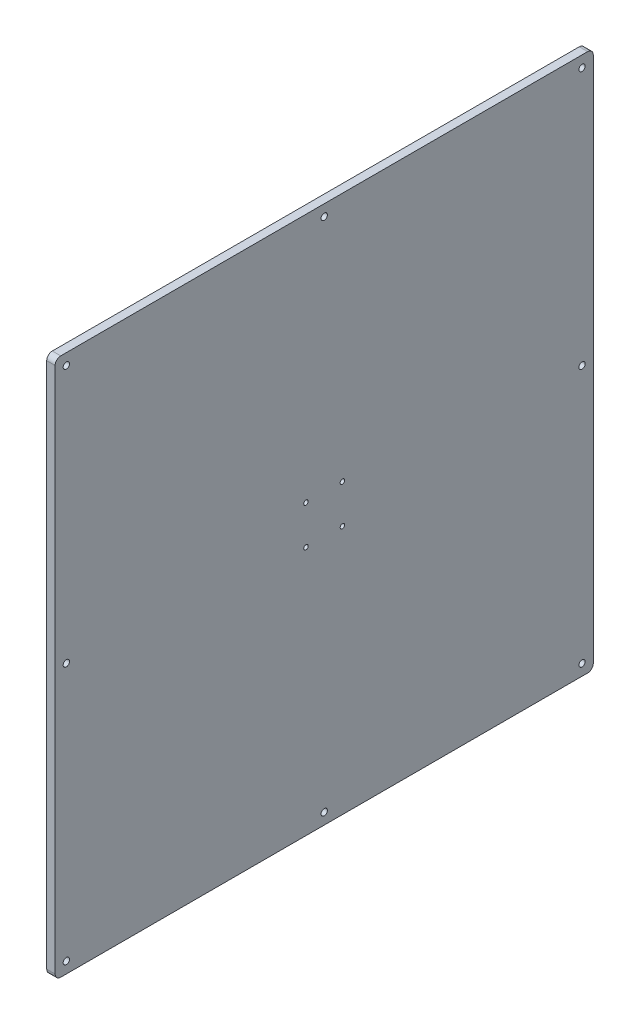
ISO-10303-21;
HEADER;
FILE_DESCRIPTION(('STEP AP214'),'2;1');
FILE_NAME('part.step','',(''),(''),'','','');
FILE_SCHEMA(('AUTOMOTIVE_DESIGN { 1 0 10303 214 1 1 1 1 }'));
ENDSEC;
DATA;
#1=APPLICATION_CONTEXT('core data for automotive mechanical design processes');
#2=APPLICATION_PROTOCOL_DEFINITION('international standard','automotive_design',2000,#1);
#3=PRODUCT_CONTEXT('',#1,'mechanical');
#4=PRODUCT('Part','Part','',(#3));
#5=PRODUCT_RELATED_PRODUCT_CATEGORY('part','',(#4));
#6=PRODUCT_DEFINITION_FORMATION('','',#4);
#7=PRODUCT_DEFINITION_CONTEXT('part definition',#1,'design');
#8=PRODUCT_DEFINITION('design','',#6,#7);
#9=PRODUCT_DEFINITION_SHAPE('','',#8);
#10=(LENGTH_UNIT() NAMED_UNIT(*) SI_UNIT(.MILLI.,.METRE.));
#11=(NAMED_UNIT(*) PLANE_ANGLE_UNIT() SI_UNIT($,.RADIAN.));
#12=(NAMED_UNIT(*) SI_UNIT($,.STERADIAN.) SOLID_ANGLE_UNIT());
#13=UNCERTAINTY_MEASURE_WITH_UNIT(LENGTH_MEASURE(1.E-05),#10,'distance_accuracy_value','');
#14=(GEOMETRIC_REPRESENTATION_CONTEXT(3) GLOBAL_UNCERTAINTY_ASSIGNED_CONTEXT((#13)) GLOBAL_UNIT_ASSIGNED_CONTEXT((#10,
#11,#12)) REPRESENTATION_CONTEXT('',''));
#15=CARTESIAN_POINT('',(0.,0.,0.));
#16=DIRECTION('',(0.,0.,1.));
#17=DIRECTION('',(1.,0.,0.));
#18=AXIS2_PLACEMENT_3D('',#15,#16,#17);
#19=CARTESIAN_POINT('',(9.525,-304.8,-304.8));
#20=DIRECTION('',(0.,0.,1.));
#21=DIRECTION('',(1.,0.,0.));
#22=AXIS2_PLACEMENT_3D('',#19,#20,#21);
#23=PLANE('',#22);
#24=DIRECTION('',(0.,1.,0.));
#25=VECTOR('',#24,1.);
#26=CARTESIAN_POINT('',(9.525,-304.8,-304.8));
#27=LINE('',#26,#25);
#28=CARTESIAN_POINT('',(9.525,-298.45,-304.8));
#29=VERTEX_POINT('',#28);
#30=CARTESIAN_POINT('',(9.525,298.45,-304.8));
#31=VERTEX_POINT('',#30);
#32=EDGE_CURVE('E149',#29,#31,#27,.T.);
#33=ORIENTED_EDGE('',*,*,#32,.F.);
#34=DIRECTION('',(-1.,0.,0.));
#35=VECTOR('',#34,1.);
#36=CARTESIAN_POINT('',(9.525,-298.45,-304.8));
#37=LINE('',#36,#35);
#38=CARTESIAN_POINT('',(0.,-298.45,-304.8));
#39=VERTEX_POINT('',#38);
#40=EDGE_CURVE('E188',#29,#39,#37,.T.);
#41=ORIENTED_EDGE('',*,*,#40,.T.);
#42=DIRECTION('',(0.,1.,0.));
#43=VECTOR('',#42,1.);
#44=CARTESIAN_POINT('',(0.,-304.8,-304.8));
#45=LINE('',#44,#43);
#46=CARTESIAN_POINT('',(0.,298.45,-304.8));
#47=VERTEX_POINT('',#46);
#48=EDGE_CURVE('E203',#39,#47,#45,.T.);
#49=ORIENTED_EDGE('',*,*,#48,.T.);
#50=DIRECTION('',(-1.,0.,0.));
#51=VECTOR('',#50,1.);
#52=CARTESIAN_POINT('',(9.525,298.45,-304.8));
#53=LINE('',#52,#51);
#54=EDGE_CURVE('E185',#47,#31,#53,.F.);
#55=ORIENTED_EDGE('',*,*,#54,.T.);
#56=EDGE_LOOP('',(#33,#41,#49,#55));
#57=FACE_BOUND('',#56,.T.);
#58=ADVANCED_FACE('F53',(#57),#23,.F.);
#59=CARTESIAN_POINT('',(9.525,304.8,304.8));
#60=DIRECTION('',(0.,-1.,0.));
#61=DIRECTION('',(0.,0.,-1.));
#62=AXIS2_PLACEMENT_3D('',#59,#60,#61);
#63=PLANE('',#62);
#64=DIRECTION('',(0.,0.,1.));
#65=VECTOR('',#64,1.);
#66=CARTESIAN_POINT('',(9.525,304.8,304.8));
#67=LINE('',#66,#65);
#68=CARTESIAN_POINT('',(9.525,304.8,-298.45));
#69=VERTEX_POINT('',#68);
#70=CARTESIAN_POINT('',(9.525,304.8,298.45));
#71=VERTEX_POINT('',#70);
#72=EDGE_CURVE('E154',#69,#71,#67,.T.);
#73=ORIENTED_EDGE('',*,*,#72,.F.);
#74=DIRECTION('',(-1.,0.,0.));
#75=VECTOR('',#74,1.);
#76=CARTESIAN_POINT('',(9.525,304.8,-298.45));
#77=LINE('',#76,#75);
#78=CARTESIAN_POINT('',(0.,304.8,-298.45));
#79=VERTEX_POINT('',#78);
#80=EDGE_CURVE('E11',#69,#79,#77,.T.);
#81=ORIENTED_EDGE('',*,*,#80,.T.);
#82=DIRECTION('',(0.,0.,1.));
#83=VECTOR('',#82,1.);
#84=CARTESIAN_POINT('',(0.,304.8,304.8));
#85=LINE('',#84,#83);
#86=CARTESIAN_POINT('',(0.,304.8,298.45));
#87=VERTEX_POINT('',#86);
#88=EDGE_CURVE('E156',#79,#87,#85,.T.);
#89=ORIENTED_EDGE('',*,*,#88,.T.);
#90=DIRECTION('',(-1.,0.,0.));
#91=VECTOR('',#90,1.);
#92=CARTESIAN_POINT('',(9.525,304.8,298.45));
#93=LINE('',#92,#91);
#94=EDGE_CURVE('E62',#87,#71,#93,.F.);
#95=ORIENTED_EDGE('',*,*,#94,.T.);
#96=EDGE_LOOP('',(#73,#81,#89,#95));
#97=FACE_BOUND('',#96,.T.);
#98=ADVANCED_FACE('F209',(#97),#63,.F.);
#99=CARTESIAN_POINT('',(9.525,-304.8,304.8));
#100=DIRECTION('',(0.,0.,-1.));
#101=DIRECTION('',(-1.,0.,0.));
#102=AXIS2_PLACEMENT_3D('',#99,#100,#101);
#103=PLANE('',#102);
#104=DIRECTION('',(0.,-1.,0.));
#105=VECTOR('',#104,1.);
#106=CARTESIAN_POINT('',(0.,-304.8,304.8));
#107=LINE('',#106,#105);
#108=CARTESIAN_POINT('',(0.,298.45,304.8));
#109=VERTEX_POINT('',#108);
#110=CARTESIAN_POINT('',(0.,-298.45,304.8));
#111=VERTEX_POINT('',#110);
#112=EDGE_CURVE('E150',#109,#111,#107,.T.);
#113=ORIENTED_EDGE('',*,*,#112,.T.);
#114=DIRECTION('',(-1.,0.,0.));
#115=VECTOR('',#114,1.);
#116=CARTESIAN_POINT('',(9.525,-298.45,304.8));
#117=LINE('',#116,#115);
#118=CARTESIAN_POINT('',(9.525,-298.45,304.8));
#119=VERTEX_POINT('',#118);
#120=EDGE_CURVE('E125',#111,#119,#117,.F.);
#121=ORIENTED_EDGE('',*,*,#120,.T.);
#122=DIRECTION('',(0.,-1.,0.));
#123=VECTOR('',#122,1.);
#124=CARTESIAN_POINT('',(9.525,-304.8,304.8));
#125=LINE('',#124,#123);
#126=CARTESIAN_POINT('',(9.525,298.45,304.8));
#127=VERTEX_POINT('',#126);
#128=EDGE_CURVE('E194',#127,#119,#125,.T.);
#129=ORIENTED_EDGE('',*,*,#128,.F.);
#130=DIRECTION('',(-1.,0.,0.));
#131=VECTOR('',#130,1.);
#132=CARTESIAN_POINT('',(9.525,298.45,304.8));
#133=LINE('',#132,#131);
#134=EDGE_CURVE('E131',#127,#109,#133,.T.);
#135=ORIENTED_EDGE('',*,*,#134,.T.);
#136=EDGE_LOOP('',(#113,#121,#129,#135));
#137=FACE_BOUND('',#136,.T.);
#138=ADVANCED_FACE('F216',(#137),#103,.F.);
#139=CARTESIAN_POINT('',(9.525,-304.8,304.8));
#140=DIRECTION('',(0.,1.,0.));
#141=DIRECTION('',(0.,0.,1.));
#142=AXIS2_PLACEMENT_3D('',#139,#140,#141);
#143=PLANE('',#142);
#144=DIRECTION('',(0.,0.,-1.));
#145=VECTOR('',#144,1.);
#146=CARTESIAN_POINT('',(9.525,-304.8,304.8));
#147=LINE('',#146,#145);
#148=CARTESIAN_POINT('',(9.525,-304.8,298.45));
#149=VERTEX_POINT('',#148);
#150=CARTESIAN_POINT('',(9.525,-304.8,-298.45));
#151=VERTEX_POINT('',#150);
#152=EDGE_CURVE('E141',#149,#151,#147,.T.);
#153=ORIENTED_EDGE('',*,*,#152,.F.);
#154=DIRECTION('',(-1.,0.,0.));
#155=VECTOR('',#154,1.);
#156=CARTESIAN_POINT('',(9.525,-304.8,298.45));
#157=LINE('',#156,#155);
#158=CARTESIAN_POINT('',(0.,-304.8,298.45));
#159=VERTEX_POINT('',#158);
#160=EDGE_CURVE('E124',#149,#159,#157,.T.);
#161=ORIENTED_EDGE('',*,*,#160,.T.);
#162=DIRECTION('',(0.,0.,-1.));
#163=VECTOR('',#162,1.);
#164=CARTESIAN_POINT('',(0.,-304.8,304.8));
#165=LINE('',#164,#163);
#166=CARTESIAN_POINT('',(0.,-304.8,-298.45));
#167=VERTEX_POINT('',#166);
#168=EDGE_CURVE('E138',#159,#167,#165,.T.);
#169=ORIENTED_EDGE('',*,*,#168,.T.);
#170=DIRECTION('',(-1.,0.,0.));
#171=VECTOR('',#170,1.);
#172=CARTESIAN_POINT('',(9.525,-304.8,-298.45));
#173=LINE('',#172,#171);
#174=EDGE_CURVE('E144',#167,#151,#173,.F.);
#175=ORIENTED_EDGE('',*,*,#174,.T.);
#176=EDGE_LOOP('',(#153,#161,#169,#175));
#177=FACE_BOUND('',#176,.T.);
#178=ADVANCED_FACE('F137',(#177),#143,.F.);
#179=CARTESIAN_POINT('',(9.525,0.,0.));
#180=DIRECTION('',(-1.,0.,0.));
#181=DIRECTION('',(0.,0.,1.));
#182=AXIS2_PLACEMENT_3D('',#179,#180,#181);
#183=PLANE('',#182);
#184=CARTESIAN_POINT('',(9.525,292.1,292.1));
#185=DIRECTION('',(1.,0.,0.));
#186=DIRECTION('',(0.,0.,-1.));
#187=AXIS2_PLACEMENT_3D('',#184,#185,#186);
#188=CIRCLE('',#187,3.57123999999998);
#189=CARTESIAN_POINT('',(9.525,292.1,288.52876));
#190=VERTEX_POINT('',#189);
#191=EDGE_CURVE('E400',#190,#190,#188,.T.);
#192=ORIENTED_EDGE('',*,*,#191,.F.);
#193=EDGE_LOOP('',(#192));
#194=FACE_BOUND('',#193,.T.);
#195=CARTESIAN_POINT('',(9.525,292.1,-292.1));
#196=DIRECTION('',(1.,0.,0.));
#197=DIRECTION('',(0.,0.,-1.));
#198=AXIS2_PLACEMENT_3D('',#195,#196,#197);
#199=CIRCLE('',#198,3.57123999999998);
#200=CARTESIAN_POINT('',(9.525,292.1,-295.67124));
#201=VERTEX_POINT('',#200);
#202=EDGE_CURVE('E394',#201,#201,#199,.T.);
#203=ORIENTED_EDGE('',*,*,#202,.F.);
#204=EDGE_LOOP('',(#203));
#205=FACE_BOUND('',#204,.T.);
#206=CARTESIAN_POINT('',(9.525,-292.1,-292.1));
#207=DIRECTION('',(1.,0.,0.));
#208=DIRECTION('',(0.,0.,-1.));
#209=AXIS2_PLACEMENT_3D('',#206,#207,#208);
#210=CIRCLE('',#209,3.57123999999998);
#211=CARTESIAN_POINT('',(9.525,-292.1,-295.67124));
#212=VERTEX_POINT('',#211);
#213=EDGE_CURVE('E388',#212,#212,#210,.T.);
#214=ORIENTED_EDGE('',*,*,#213,.F.);
#215=EDGE_LOOP('',(#214));
#216=FACE_BOUND('',#215,.T.);
#217=CARTESIAN_POINT('',(9.525,-292.1,292.1));
#218=DIRECTION('',(1.,0.,0.));
#219=DIRECTION('',(0.,0.,-1.));
#220=AXIS2_PLACEMENT_3D('',#217,#218,#219);
#221=CIRCLE('',#220,3.57123999999998);
#222=CARTESIAN_POINT('',(9.525,-292.1,288.52876));
#223=VERTEX_POINT('',#222);
#224=EDGE_CURVE('E382',#223,#223,#221,.T.);
#225=ORIENTED_EDGE('',*,*,#224,.F.);
#226=EDGE_LOOP('',(#225));
#227=FACE_BOUND('',#226,.T.);
#228=CARTESIAN_POINT('',(9.525,292.1,0.));
#229=DIRECTION('',(1.,0.,0.));
#230=DIRECTION('',(0.,0.,-1.));
#231=AXIS2_PLACEMENT_3D('',#228,#229,#230);
#232=CIRCLE('',#231,3.57123999999998);
#233=CARTESIAN_POINT('',(9.525,292.1,-3.57123999999998));
#234=VERTEX_POINT('',#233);
#235=EDGE_CURVE('E376',#234,#234,#232,.T.);
#236=ORIENTED_EDGE('',*,*,#235,.F.);
#237=EDGE_LOOP('',(#236));
#238=FACE_BOUND('',#237,.T.);
#239=CARTESIAN_POINT('',(9.525,1.11022302462516E-13,292.1));
#240=DIRECTION('',(1.,0.,0.));
#241=DIRECTION('',(0.,0.,-1.));
#242=AXIS2_PLACEMENT_3D('',#239,#240,#241);
#243=CIRCLE('',#242,3.57124);
#244=CARTESIAN_POINT('',(9.525,1.11022302462516E-13,288.52876));
#245=VERTEX_POINT('',#244);
#246=EDGE_CURVE('E370',#245,#245,#243,.T.);
#247=ORIENTED_EDGE('',*,*,#246,.F.);
#248=EDGE_LOOP('',(#247));
#249=FACE_BOUND('',#248,.T.);
#250=CARTESIAN_POINT('',(9.525,-292.1,0.));
#251=DIRECTION('',(1.,0.,0.));
#252=DIRECTION('',(0.,0.,-1.));
#253=AXIS2_PLACEMENT_3D('',#250,#251,#252);
#254=CIRCLE('',#253,3.57123999999998);
#255=CARTESIAN_POINT('',(9.525,-292.1,-3.57123999999998));
#256=VERTEX_POINT('',#255);
#257=EDGE_CURVE('E364',#256,#256,#254,.T.);
#258=ORIENTED_EDGE('',*,*,#257,.F.);
#259=EDGE_LOOP('',(#258));
#260=FACE_BOUND('',#259,.T.);
#261=CARTESIAN_POINT('',(9.525,1.11022302462516E-13,-292.1));
#262=DIRECTION('',(1.,0.,0.));
#263=DIRECTION('',(0.,0.,-1.));
#264=AXIS2_PLACEMENT_3D('',#261,#262,#263);
#265=CIRCLE('',#264,3.57124);
#266=CARTESIAN_POINT('',(9.525,1.11022302462516E-13,-295.67124));
#267=VERTEX_POINT('',#266);
#268=EDGE_CURVE('E358',#267,#267,#265,.T.);
#269=ORIENTED_EDGE('',*,*,#268,.F.);
#270=EDGE_LOOP('',(#269));
#271=FACE_BOUND('',#270,.T.);
#272=CARTESIAN_POINT('',(9.525,21.9075,20.6375));
#273=DIRECTION('',(1.,0.,0.));
#274=DIRECTION('',(0.,0.,-1.));
#275=AXIS2_PLACEMENT_3D('',#272,#273,#274);
#276=CIRCLE('',#275,2.55269999999999);
#277=CARTESIAN_POINT('',(9.525,21.9075,18.0848));
#278=VERTEX_POINT('',#277);
#279=EDGE_CURVE('E352',#278,#278,#276,.T.);
#280=ORIENTED_EDGE('',*,*,#279,.F.);
#281=EDGE_LOOP('',(#280));
#282=FACE_BOUND('',#281,.T.);
#283=CARTESIAN_POINT('',(9.525,21.9075,-20.6375));
#284=DIRECTION('',(1.,0.,0.));
#285=DIRECTION('',(0.,0.,-1.));
#286=AXIS2_PLACEMENT_3D('',#283,#284,#285);
#287=CIRCLE('',#286,2.55269999999999);
#288=CARTESIAN_POINT('',(9.525,21.9075,-23.1902));
#289=VERTEX_POINT('',#288);
#290=EDGE_CURVE('E346',#289,#289,#287,.T.);
#291=ORIENTED_EDGE('',*,*,#290,.F.);
#292=EDGE_LOOP('',(#291));
#293=FACE_BOUND('',#292,.T.);
#294=CARTESIAN_POINT('',(9.525,-21.9075,-20.6375));
#295=DIRECTION('',(1.,0.,0.));
#296=DIRECTION('',(0.,0.,-1.));
#297=AXIS2_PLACEMENT_3D('',#294,#295,#296);
#298=CIRCLE('',#297,2.55269999999999);
#299=CARTESIAN_POINT('',(9.525,-21.9075,-23.1902));
#300=VERTEX_POINT('',#299);
#301=EDGE_CURVE('E340',#300,#300,#298,.T.);
#302=ORIENTED_EDGE('',*,*,#301,.F.);
#303=EDGE_LOOP('',(#302));
#304=FACE_BOUND('',#303,.T.);
#305=CARTESIAN_POINT('',(9.525,-21.9075,20.6375));
#306=DIRECTION('',(1.,0.,0.));
#307=DIRECTION('',(0.,0.,-1.));
#308=AXIS2_PLACEMENT_3D('',#305,#306,#307);
#309=CIRCLE('',#308,2.55269999999999);
#310=CARTESIAN_POINT('',(9.525,-21.9075,18.0848));
#311=VERTEX_POINT('',#310);
#312=EDGE_CURVE('E333',#311,#311,#309,.T.);
#313=ORIENTED_EDGE('',*,*,#312,.F.);
#314=EDGE_LOOP('',(#313));
#315=FACE_BOUND('',#314,.T.);
#316=ORIENTED_EDGE('',*,*,#128,.T.);
#317=CARTESIAN_POINT('',(9.525,-298.45,298.45));
#318=DIRECTION('',(-1.,0.,0.));
#319=DIRECTION('',(0.,0.,1.));
#320=AXIS2_PLACEMENT_3D('',#317,#318,#319);
#321=CIRCLE('',#320,6.35);
#322=EDGE_CURVE('E182',#119,#149,#321,.F.);
#323=ORIENTED_EDGE('',*,*,#322,.T.);
#324=ORIENTED_EDGE('',*,*,#152,.T.);
#325=CARTESIAN_POINT('',(9.525,-298.45,-298.45));
#326=DIRECTION('',(-1.,0.,0.));
#327=DIRECTION('',(0.,0.,1.));
#328=AXIS2_PLACEMENT_3D('',#325,#326,#327);
#329=CIRCLE('',#328,6.35);
#330=EDGE_CURVE('E179',#151,#29,#329,.F.);
#331=ORIENTED_EDGE('',*,*,#330,.T.);
#332=ORIENTED_EDGE('',*,*,#32,.T.);
#333=CARTESIAN_POINT('',(9.525,298.45,-298.45));
#334=DIRECTION('',(-1.,0.,0.));
#335=DIRECTION('',(0.,0.,1.));
#336=AXIS2_PLACEMENT_3D('',#333,#334,#335);
#337=CIRCLE('',#336,6.35);
#338=EDGE_CURVE('E75',#31,#69,#337,.F.);
#339=ORIENTED_EDGE('',*,*,#338,.T.);
#340=ORIENTED_EDGE('',*,*,#72,.T.);
#341=CARTESIAN_POINT('',(9.525,298.45,298.45));
#342=DIRECTION('',(-1.,0.,0.));
#343=DIRECTION('',(0.,0.,1.));
#344=AXIS2_PLACEMENT_3D('',#341,#342,#343);
#345=CIRCLE('',#344,6.35);
#346=EDGE_CURVE('E174',#71,#127,#345,.F.);
#347=ORIENTED_EDGE('',*,*,#346,.T.);
#348=EDGE_LOOP('',(#316,#323,#324,#331,#332,#339,#340,#347));
#349=FACE_BOUND('',#348,.T.);
#350=ADVANCED_FACE('F214',(#194,#205,#216,#227,#238,#249,#260,#271,#282,#293,#304,#315,#349),
#183,.F.);
#351=CARTESIAN_POINT('',(0.,0.,0.));
#352=DIRECTION('',(-1.,0.,0.));
#353=DIRECTION('',(0.,0.,1.));
#354=AXIS2_PLACEMENT_3D('',#351,#352,#353);
#355=PLANE('',#354);
#356=CARTESIAN_POINT('',(0.,292.1,292.1));
#357=DIRECTION('',(1.,0.,0.));
#358=DIRECTION('',(0.,0.,-1.));
#359=AXIS2_PLACEMENT_3D('',#356,#357,#358);
#360=CIRCLE('',#359,3.57123999999998);
#361=CARTESIAN_POINT('',(0.,292.1,288.52876));
#362=VERTEX_POINT('',#361);
#363=EDGE_CURVE('E290',#362,#362,#360,.T.);
#364=ORIENTED_EDGE('',*,*,#363,.T.);
#365=EDGE_LOOP('',(#364));
#366=FACE_BOUND('',#365,.T.);
#367=CARTESIAN_POINT('',(0.,292.1,-292.1));
#368=DIRECTION('',(1.,0.,0.));
#369=DIRECTION('',(0.,0.,-1.));
#370=AXIS2_PLACEMENT_3D('',#367,#368,#369);
#371=CIRCLE('',#370,3.57123999999998);
#372=CARTESIAN_POINT('',(0.,292.1,-295.67124));
#373=VERTEX_POINT('',#372);
#374=EDGE_CURVE('E294',#373,#373,#371,.T.);
#375=ORIENTED_EDGE('',*,*,#374,.T.);
#376=EDGE_LOOP('',(#375));
#377=FACE_BOUND('',#376,.T.);
#378=CARTESIAN_POINT('',(0.,-292.1,-292.1));
#379=DIRECTION('',(1.,0.,0.));
#380=DIRECTION('',(0.,0.,-1.));
#381=AXIS2_PLACEMENT_3D('',#378,#379,#380);
#382=CIRCLE('',#381,3.57123999999998);
#383=CARTESIAN_POINT('',(0.,-292.1,-295.67124));
#384=VERTEX_POINT('',#383);
#385=EDGE_CURVE('E298',#384,#384,#382,.T.);
#386=ORIENTED_EDGE('',*,*,#385,.T.);
#387=EDGE_LOOP('',(#386));
#388=FACE_BOUND('',#387,.T.);
#389=CARTESIAN_POINT('',(0.,-292.1,292.1));
#390=DIRECTION('',(1.,0.,0.));
#391=DIRECTION('',(0.,0.,-1.));
#392=AXIS2_PLACEMENT_3D('',#389,#390,#391);
#393=CIRCLE('',#392,3.57123999999998);
#394=CARTESIAN_POINT('',(0.,-292.1,288.52876));
#395=VERTEX_POINT('',#394);
#396=EDGE_CURVE('E302',#395,#395,#393,.T.);
#397=ORIENTED_EDGE('',*,*,#396,.T.);
#398=EDGE_LOOP('',(#397));
#399=FACE_BOUND('',#398,.T.);
#400=CARTESIAN_POINT('',(0.,292.1,0.));
#401=DIRECTION('',(1.,0.,0.));
#402=DIRECTION('',(0.,0.,-1.));
#403=AXIS2_PLACEMENT_3D('',#400,#401,#402);
#404=CIRCLE('',#403,3.57123999999998);
#405=CARTESIAN_POINT('',(0.,292.1,-3.57123999999998));
#406=VERTEX_POINT('',#405);
#407=EDGE_CURVE('E306',#406,#406,#404,.T.);
#408=ORIENTED_EDGE('',*,*,#407,.T.);
#409=EDGE_LOOP('',(#408));
#410=FACE_BOUND('',#409,.T.);
#411=CARTESIAN_POINT('',(0.,1.11022302462516E-13,292.1));
#412=DIRECTION('',(1.,0.,0.));
#413=DIRECTION('',(0.,0.,-1.));
#414=AXIS2_PLACEMENT_3D('',#411,#412,#413);
#415=CIRCLE('',#414,3.57124);
#416=CARTESIAN_POINT('',(0.,1.11022302462516E-13,288.52876));
#417=VERTEX_POINT('',#416);
#418=EDGE_CURVE('E310',#417,#417,#415,.T.);
#419=ORIENTED_EDGE('',*,*,#418,.T.);
#420=EDGE_LOOP('',(#419));
#421=FACE_BOUND('',#420,.T.);
#422=CARTESIAN_POINT('',(0.,-292.1,0.));
#423=DIRECTION('',(1.,0.,0.));
#424=DIRECTION('',(0.,0.,-1.));
#425=AXIS2_PLACEMENT_3D('',#422,#423,#424);
#426=CIRCLE('',#425,3.57123999999998);
#427=CARTESIAN_POINT('',(0.,-292.1,-3.57123999999998));
#428=VERTEX_POINT('',#427);
#429=EDGE_CURVE('E314',#428,#428,#426,.T.);
#430=ORIENTED_EDGE('',*,*,#429,.T.);
#431=EDGE_LOOP('',(#430));
#432=FACE_BOUND('',#431,.T.);
#433=CARTESIAN_POINT('',(0.,1.11022302462516E-13,-292.1));
#434=DIRECTION('',(1.,0.,0.));
#435=DIRECTION('',(0.,0.,-1.));
#436=AXIS2_PLACEMENT_3D('',#433,#434,#435);
#437=CIRCLE('',#436,3.57124);
#438=CARTESIAN_POINT('',(0.,1.11022302462516E-13,-295.67124));
#439=VERTEX_POINT('',#438);
#440=EDGE_CURVE('E317',#439,#439,#437,.T.);
#441=ORIENTED_EDGE('',*,*,#440,.T.);
#442=EDGE_LOOP('',(#441));
#443=FACE_BOUND('',#442,.T.);
#444=CARTESIAN_POINT('',(0.,21.9075,20.6375));
#445=DIRECTION('',(1.,0.,0.));
#446=DIRECTION('',(0.,0.,-1.));
#447=AXIS2_PLACEMENT_3D('',#444,#445,#446);
#448=CIRCLE('',#447,2.55269999999999);
#449=CARTESIAN_POINT('',(0.,21.9075,18.0848));
#450=VERTEX_POINT('',#449);
#451=EDGE_CURVE('E321',#450,#450,#448,.T.);
#452=ORIENTED_EDGE('',*,*,#451,.T.);
#453=EDGE_LOOP('',(#452));
#454=FACE_BOUND('',#453,.T.);
#455=CARTESIAN_POINT('',(0.,21.9075,-20.6375));
#456=DIRECTION('',(1.,0.,0.));
#457=DIRECTION('',(0.,0.,-1.));
#458=AXIS2_PLACEMENT_3D('',#455,#456,#457);
#459=CIRCLE('',#458,2.55269999999999);
#460=CARTESIAN_POINT('',(0.,21.9075,-23.1902));
#461=VERTEX_POINT('',#460);
#462=EDGE_CURVE('E325',#461,#461,#459,.T.);
#463=ORIENTED_EDGE('',*,*,#462,.T.);
#464=EDGE_LOOP('',(#463));
#465=FACE_BOUND('',#464,.T.);
#466=CARTESIAN_POINT('',(0.,-21.9075,-20.6375));
#467=DIRECTION('',(1.,0.,0.));
#468=DIRECTION('',(0.,0.,-1.));
#469=AXIS2_PLACEMENT_3D('',#466,#467,#468);
#470=CIRCLE('',#469,2.55269999999999);
#471=CARTESIAN_POINT('',(0.,-21.9075,-23.1902));
#472=VERTEX_POINT('',#471);
#473=EDGE_CURVE('E329',#472,#472,#470,.T.);
#474=ORIENTED_EDGE('',*,*,#473,.T.);
#475=EDGE_LOOP('',(#474));
#476=FACE_BOUND('',#475,.T.);
#477=CARTESIAN_POINT('',(0.,-21.9075,20.6375));
#478=DIRECTION('',(1.,0.,0.));
#479=DIRECTION('',(0.,0.,-1.));
#480=AXIS2_PLACEMENT_3D('',#477,#478,#479);
#481=CIRCLE('',#480,2.55269999999999);
#482=CARTESIAN_POINT('',(0.,-21.9075,18.0848));
#483=VERTEX_POINT('',#482);
#484=EDGE_CURVE('E206',#483,#483,#481,.T.);
#485=ORIENTED_EDGE('',*,*,#484,.T.);
#486=EDGE_LOOP('',(#485));
#487=FACE_BOUND('',#486,.T.);
#488=ORIENTED_EDGE('',*,*,#168,.F.);
#489=CARTESIAN_POINT('',(0.,-298.45,298.45));
#490=DIRECTION('',(-1.,0.,0.));
#491=DIRECTION('',(0.,0.,1.));
#492=AXIS2_PLACEMENT_3D('',#489,#490,#491);
#493=CIRCLE('',#492,6.35);
#494=EDGE_CURVE('E120',#159,#111,#493,.T.);
#495=ORIENTED_EDGE('',*,*,#494,.T.);
#496=ORIENTED_EDGE('',*,*,#112,.F.);
#497=CARTESIAN_POINT('',(0.,298.45,298.45));
#498=DIRECTION('',(-1.,0.,0.));
#499=DIRECTION('',(0.,0.,1.));
#500=AXIS2_PLACEMENT_3D('',#497,#498,#499);
#501=CIRCLE('',#500,6.35);
#502=EDGE_CURVE('E143',#109,#87,#501,.T.);
#503=ORIENTED_EDGE('',*,*,#502,.T.);
#504=ORIENTED_EDGE('',*,*,#88,.F.);
#505=CARTESIAN_POINT('',(0.,298.45,-298.45));
#506=DIRECTION('',(-1.,0.,0.));
#507=DIRECTION('',(0.,0.,1.));
#508=AXIS2_PLACEMENT_3D('',#505,#506,#507);
#509=CIRCLE('',#508,6.35);
#510=EDGE_CURVE('E164',#79,#47,#509,.T.);
#511=ORIENTED_EDGE('',*,*,#510,.T.);
#512=ORIENTED_EDGE('',*,*,#48,.F.);
#513=CARTESIAN_POINT('',(0.,-298.45,-298.45));
#514=DIRECTION('',(-1.,0.,0.));
#515=DIRECTION('',(0.,0.,1.));
#516=AXIS2_PLACEMENT_3D('',#513,#514,#515);
#517=CIRCLE('',#516,6.35);
#518=EDGE_CURVE('E132',#39,#167,#517,.T.);
#519=ORIENTED_EDGE('',*,*,#518,.T.);
#520=EDGE_LOOP('',(#488,#495,#496,#503,#504,#511,#512,#519));
#521=FACE_BOUND('',#520,.T.);
#522=ADVANCED_FACE('F146',(#366,#377,#388,#399,#410,#421,#432,#443,#454,#465,#476,#487,#521),
#355,.T.);
#523=CARTESIAN_POINT('',(9.525,-21.9075,20.6375));
#524=DIRECTION('',(1.,0.,0.));
#525=DIRECTION('',(0.,0.,-1.));
#526=AXIS2_PLACEMENT_3D('',#523,#524,#525);
#527=CYLINDRICAL_SURFACE('',#526,2.55269999999999);
#528=ORIENTED_EDGE('',*,*,#484,.F.);
#529=EDGE_LOOP('',(#528));
#530=FACE_BOUND('',#529,.T.);
#531=ORIENTED_EDGE('',*,*,#312,.T.);
#532=EDGE_LOOP('',(#531));
#533=FACE_BOUND('',#532,.T.);
#534=ADVANCED_FACE('F277',(#530,#533),#527,.F.);
#535=CARTESIAN_POINT('',(9.525,-21.9075,-20.6375));
#536=DIRECTION('',(1.,0.,0.));
#537=DIRECTION('',(0.,0.,-1.));
#538=AXIS2_PLACEMENT_3D('',#535,#536,#537);
#539=CYLINDRICAL_SURFACE('',#538,2.55269999999999);
#540=ORIENTED_EDGE('',*,*,#473,.F.);
#541=EDGE_LOOP('',(#540));
#542=FACE_BOUND('',#541,.T.);
#543=ORIENTED_EDGE('',*,*,#301,.T.);
#544=EDGE_LOOP('',(#543));
#545=FACE_BOUND('',#544,.T.);
#546=ADVANCED_FACE('F273',(#542,#545),#539,.F.);
#547=CARTESIAN_POINT('',(9.525,21.9075,-20.6375));
#548=DIRECTION('',(1.,0.,0.));
#549=DIRECTION('',(0.,0.,-1.));
#550=AXIS2_PLACEMENT_3D('',#547,#548,#549);
#551=CYLINDRICAL_SURFACE('',#550,2.55269999999999);
#552=ORIENTED_EDGE('',*,*,#462,.F.);
#553=EDGE_LOOP('',(#552));
#554=FACE_BOUND('',#553,.T.);
#555=ORIENTED_EDGE('',*,*,#290,.T.);
#556=EDGE_LOOP('',(#555));
#557=FACE_BOUND('',#556,.T.);
#558=ADVANCED_FACE('F269',(#554,#557),#551,.F.);
#559=CARTESIAN_POINT('',(9.525,21.9075,20.6375));
#560=DIRECTION('',(1.,0.,0.));
#561=DIRECTION('',(0.,0.,-1.));
#562=AXIS2_PLACEMENT_3D('',#559,#560,#561);
#563=CYLINDRICAL_SURFACE('',#562,2.55269999999999);
#564=ORIENTED_EDGE('',*,*,#451,.F.);
#565=EDGE_LOOP('',(#564));
#566=FACE_BOUND('',#565,.T.);
#567=ORIENTED_EDGE('',*,*,#279,.T.);
#568=EDGE_LOOP('',(#567));
#569=FACE_BOUND('',#568,.T.);
#570=ADVANCED_FACE('F236',(#566,#569),#563,.F.);
#571=CARTESIAN_POINT('',(9.525,-298.45,298.45));
#572=DIRECTION('',(-1.,0.,0.));
#573=DIRECTION('',(0.,0.,1.));
#574=AXIS2_PLACEMENT_3D('',#571,#572,#573);
#575=CYLINDRICAL_SURFACE('',#574,6.35);
#576=ORIENTED_EDGE('',*,*,#322,.F.);
#577=ORIENTED_EDGE('',*,*,#120,.F.);
#578=ORIENTED_EDGE('',*,*,#494,.F.);
#579=ORIENTED_EDGE('',*,*,#160,.F.);
#580=EDGE_LOOP('',(#576,#577,#578,#579));
#581=FACE_BOUND('',#580,.T.);
#582=ADVANCED_FACE('F123',(#581),#575,.T.);
#583=CARTESIAN_POINT('',(9.525,-298.45,-298.45));
#584=DIRECTION('',(-1.,0.,0.));
#585=DIRECTION('',(0.,0.,1.));
#586=AXIS2_PLACEMENT_3D('',#583,#584,#585);
#587=CYLINDRICAL_SURFACE('',#586,6.35);
#588=ORIENTED_EDGE('',*,*,#330,.F.);
#589=ORIENTED_EDGE('',*,*,#174,.F.);
#590=ORIENTED_EDGE('',*,*,#518,.F.);
#591=ORIENTED_EDGE('',*,*,#40,.F.);
#592=EDGE_LOOP('',(#588,#589,#590,#591));
#593=FACE_BOUND('',#592,.T.);
#594=ADVANCED_FACE('F235',(#593),#587,.T.);
#595=CARTESIAN_POINT('',(9.525,298.45,-298.45));
#596=DIRECTION('',(-1.,0.,0.));
#597=DIRECTION('',(0.,0.,1.));
#598=AXIS2_PLACEMENT_3D('',#595,#596,#597);
#599=CYLINDRICAL_SURFACE('',#598,6.35);
#600=ORIENTED_EDGE('',*,*,#338,.F.);
#601=ORIENTED_EDGE('',*,*,#54,.F.);
#602=ORIENTED_EDGE('',*,*,#510,.F.);
#603=ORIENTED_EDGE('',*,*,#80,.F.);
#604=EDGE_LOOP('',(#600,#601,#602,#603));
#605=FACE_BOUND('',#604,.T.);
#606=ADVANCED_FACE('F238',(#605),#599,.T.);
#607=CARTESIAN_POINT('',(9.525,298.45,298.45));
#608=DIRECTION('',(-1.,0.,0.));
#609=DIRECTION('',(0.,0.,1.));
#610=AXIS2_PLACEMENT_3D('',#607,#608,#609);
#611=CYLINDRICAL_SURFACE('',#610,6.35);
#612=ORIENTED_EDGE('',*,*,#346,.F.);
#613=ORIENTED_EDGE('',*,*,#94,.F.);
#614=ORIENTED_EDGE('',*,*,#502,.F.);
#615=ORIENTED_EDGE('',*,*,#134,.F.);
#616=EDGE_LOOP('',(#612,#613,#614,#615));
#617=FACE_BOUND('',#616,.T.);
#618=ADVANCED_FACE('F55',(#617),#611,.T.);
#619=CARTESIAN_POINT('',(9.525,1.11022302462516E-13,-292.1));
#620=DIRECTION('',(1.,0.,0.));
#621=DIRECTION('',(0.,0.,-1.));
#622=AXIS2_PLACEMENT_3D('',#619,#620,#621);
#623=CYLINDRICAL_SURFACE('',#622,3.57124);
#624=ORIENTED_EDGE('',*,*,#440,.F.);
#625=EDGE_LOOP('',(#624));
#626=FACE_BOUND('',#625,.T.);
#627=ORIENTED_EDGE('',*,*,#268,.T.);
#628=EDGE_LOOP('',(#627));
#629=FACE_BOUND('',#628,.T.);
#630=ADVANCED_FACE('F245',(#626,#629),#623,.F.);
#631=CARTESIAN_POINT('',(9.525,-292.1,0.));
#632=DIRECTION('',(1.,0.,0.));
#633=DIRECTION('',(0.,0.,-1.));
#634=AXIS2_PLACEMENT_3D('',#631,#632,#633);
#635=CYLINDRICAL_SURFACE('',#634,3.57123999999998);
#636=ORIENTED_EDGE('',*,*,#429,.F.);
#637=EDGE_LOOP('',(#636));
#638=FACE_BOUND('',#637,.T.);
#639=ORIENTED_EDGE('',*,*,#257,.T.);
#640=EDGE_LOOP('',(#639));
#641=FACE_BOUND('',#640,.T.);
#642=ADVANCED_FACE('F253',(#638,#641),#635,.F.);
#643=CARTESIAN_POINT('',(9.525,1.11022302462516E-13,292.1));
#644=DIRECTION('',(1.,0.,0.));
#645=DIRECTION('',(0.,0.,-1.));
#646=AXIS2_PLACEMENT_3D('',#643,#644,#645);
#647=CYLINDRICAL_SURFACE('',#646,3.57124);
#648=ORIENTED_EDGE('',*,*,#418,.F.);
#649=EDGE_LOOP('',(#648));
#650=FACE_BOUND('',#649,.T.);
#651=ORIENTED_EDGE('',*,*,#246,.T.);
#652=EDGE_LOOP('',(#651));
#653=FACE_BOUND('',#652,.T.);
#654=ADVANCED_FACE('F260',(#650,#653),#647,.F.);
#655=CARTESIAN_POINT('',(9.525,292.1,0.));
#656=DIRECTION('',(1.,0.,0.));
#657=DIRECTION('',(0.,0.,-1.));
#658=AXIS2_PLACEMENT_3D('',#655,#656,#657);
#659=CYLINDRICAL_SURFACE('',#658,3.57123999999998);
#660=ORIENTED_EDGE('',*,*,#407,.F.);
#661=EDGE_LOOP('',(#660));
#662=FACE_BOUND('',#661,.T.);
#663=ORIENTED_EDGE('',*,*,#235,.T.);
#664=EDGE_LOOP('',(#663));
#665=FACE_BOUND('',#664,.T.);
#666=ADVANCED_FACE('F435',(#662,#665),#659,.F.);
#667=CARTESIAN_POINT('',(9.525,-292.1,292.1));
#668=DIRECTION('',(1.,0.,0.));
#669=DIRECTION('',(0.,0.,-1.));
#670=AXIS2_PLACEMENT_3D('',#667,#668,#669);
#671=CYLINDRICAL_SURFACE('',#670,3.57123999999998);
#672=ORIENTED_EDGE('',*,*,#396,.F.);
#673=EDGE_LOOP('',(#672));
#674=FACE_BOUND('',#673,.T.);
#675=ORIENTED_EDGE('',*,*,#224,.T.);
#676=EDGE_LOOP('',(#675));
#677=FACE_BOUND('',#676,.T.);
#678=ADVANCED_FACE('F440',(#674,#677),#671,.F.);
#679=CARTESIAN_POINT('',(9.525,-292.1,-292.1));
#680=DIRECTION('',(1.,0.,0.));
#681=DIRECTION('',(0.,0.,-1.));
#682=AXIS2_PLACEMENT_3D('',#679,#680,#681);
#683=CYLINDRICAL_SURFACE('',#682,3.57123999999998);
#684=ORIENTED_EDGE('',*,*,#385,.F.);
#685=EDGE_LOOP('',(#684));
#686=FACE_BOUND('',#685,.T.);
#687=ORIENTED_EDGE('',*,*,#213,.T.);
#688=EDGE_LOOP('',(#687));
#689=FACE_BOUND('',#688,.T.);
#690=ADVANCED_FACE('F446',(#686,#689),#683,.F.);
#691=CARTESIAN_POINT('',(9.525,292.1,-292.1));
#692=DIRECTION('',(1.,0.,0.));
#693=DIRECTION('',(0.,0.,-1.));
#694=AXIS2_PLACEMENT_3D('',#691,#692,#693);
#695=CYLINDRICAL_SURFACE('',#694,3.57123999999998);
#696=ORIENTED_EDGE('',*,*,#374,.F.);
#697=EDGE_LOOP('',(#696));
#698=FACE_BOUND('',#697,.T.);
#699=ORIENTED_EDGE('',*,*,#202,.T.);
#700=EDGE_LOOP('',(#699));
#701=FACE_BOUND('',#700,.T.);
#702=ADVANCED_FACE('F450',(#698,#701),#695,.F.);
#703=CARTESIAN_POINT('',(9.525,292.1,292.1));
#704=DIRECTION('',(1.,0.,0.));
#705=DIRECTION('',(0.,0.,-1.));
#706=AXIS2_PLACEMENT_3D('',#703,#704,#705);
#707=CYLINDRICAL_SURFACE('',#706,3.57123999999998);
#708=ORIENTED_EDGE('',*,*,#363,.F.);
#709=EDGE_LOOP('',(#708));
#710=FACE_BOUND('',#709,.T.);
#711=ORIENTED_EDGE('',*,*,#191,.T.);
#712=EDGE_LOOP('',(#711));
#713=FACE_BOUND('',#712,.T.);
#714=ADVANCED_FACE('F405',(#710,#713),#707,.F.);
#715=CLOSED_SHELL('',(#58,#98,#138,#178,#350,#522,#534,#546,#558,#570,#582,#594,#606,#618,#630,
#642,#654,#666,#678,#690,#702,#714));
#716=MANIFOLD_SOLID_BREP('B2',#715);
#717=ADVANCED_BREP_SHAPE_REPRESENTATION('',(#18,#716),#14);
#718=SHAPE_DEFINITION_REPRESENTATION(#9,#717);
ENDSEC;
END-ISO-10303-21;
